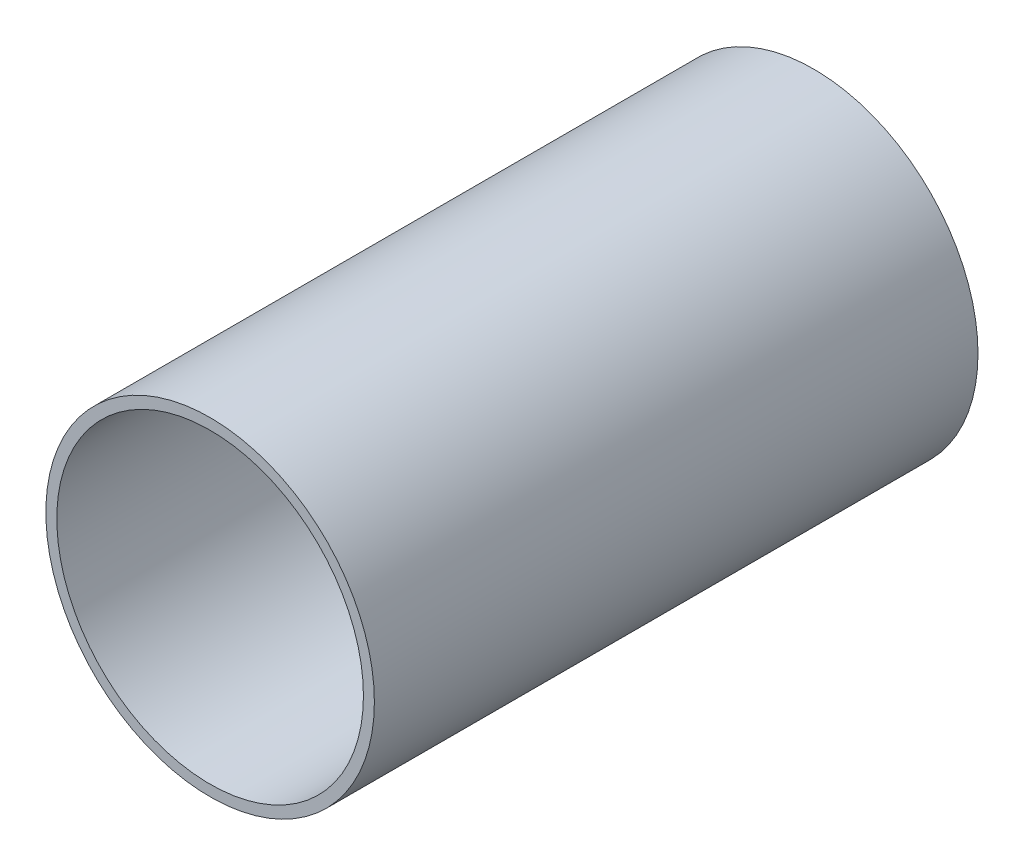
ISO-10303-21;
HEADER;
FILE_DESCRIPTION(('STEP AP214'),'2;1');
FILE_NAME('part.step','',(''),(''),'','','');
FILE_SCHEMA(('AUTOMOTIVE_DESIGN { 1 0 10303 214 1 1 1 1 }'));
ENDSEC;
DATA;
#1=APPLICATION_CONTEXT('core data for automotive mechanical design processes');
#2=APPLICATION_PROTOCOL_DEFINITION('international standard','automotive_design',2000,#1);
#3=PRODUCT_CONTEXT('',#1,'mechanical');
#4=PRODUCT('Part','Part','',(#3));
#5=PRODUCT_RELATED_PRODUCT_CATEGORY('part','',(#4));
#6=PRODUCT_DEFINITION_FORMATION('','',#4);
#7=PRODUCT_DEFINITION_CONTEXT('part definition',#1,'design');
#8=PRODUCT_DEFINITION('design','',#6,#7);
#9=PRODUCT_DEFINITION_SHAPE('','',#8);
#10=(LENGTH_UNIT() NAMED_UNIT(*) SI_UNIT(.MILLI.,.METRE.));
#11=(NAMED_UNIT(*) PLANE_ANGLE_UNIT() SI_UNIT($,.RADIAN.));
#12=(NAMED_UNIT(*) SI_UNIT($,.STERADIAN.) SOLID_ANGLE_UNIT());
#13=UNCERTAINTY_MEASURE_WITH_UNIT(LENGTH_MEASURE(1.E-05),#10,'distance_accuracy_value','');
#14=(GEOMETRIC_REPRESENTATION_CONTEXT(3) GLOBAL_UNCERTAINTY_ASSIGNED_CONTEXT((#13)) GLOBAL_UNIT_ASSIGNED_CONTEXT((#10,
#11,#12)) REPRESENTATION_CONTEXT('',''));
#15=CARTESIAN_POINT('',(0.,0.,0.));
#16=DIRECTION('',(0.,0.,1.));
#17=DIRECTION('',(1.,0.,0.));
#18=AXIS2_PLACEMENT_3D('',#15,#16,#17);
#19=CARTESIAN_POINT('',(0.,0.,0.));
#20=DIRECTION('',(0.,0.,-1.));
#21=DIRECTION('',(1.,0.,0.));
#22=AXIS2_PLACEMENT_3D('',#19,#20,#21);
#23=CYLINDRICAL_SURFACE('',#22,0.381);
#24=CARTESIAN_POINT('',(0.,0.,1.39999974));
#25=DIRECTION('',(0.,0.,1.));
#26=DIRECTION('',(1.,0.,0.));
#27=AXIS2_PLACEMENT_3D('',#24,#25,#26);
#28=CIRCLE('',#27,0.381);
#29=CARTESIAN_POINT('',(0.381,0.,1.39999974));
#30=VERTEX_POINT('',#29);
#31=EDGE_CURVE('E11',#30,#30,#28,.T.);
#32=ORIENTED_EDGE('',*,*,#31,.F.);
#33=DIRECTION('',(0.,0.,1.));
#34=VECTOR('',#33,1.);
#35=CARTESIAN_POINT('',(0.381,0.,0.));
#36=LINE('',#35,#34);
#37=CARTESIAN_POINT('',(0.381,0.,0.));
#38=VERTEX_POINT('',#37);
#39=EDGE_CURVE('E24',#38,#30,#36,.T.);
#40=ORIENTED_EDGE('',*,*,#39,.F.);
#41=CARTESIAN_POINT('',(0.,0.,0.));
#42=DIRECTION('',(0.,0.,1.));
#43=DIRECTION('',(1.,0.,0.));
#44=AXIS2_PLACEMENT_3D('',#41,#42,#43);
#45=CIRCLE('',#44,0.381);
#46=EDGE_CURVE('E46',#38,#38,#45,.T.);
#47=ORIENTED_EDGE('',*,*,#46,.T.);
#48=ORIENTED_EDGE('',*,*,#39,.T.);
#49=EDGE_LOOP('',(#32,#40,#47,#48));
#50=FACE_BOUND('',#49,.T.);
#51=ADVANCED_FACE('F17',(#50),#23,.T.);
#52=CARTESIAN_POINT('',(0.,0.,0.));
#53=DIRECTION('',(0.,0.,-1.));
#54=DIRECTION('',(1.,0.,0.));
#55=AXIS2_PLACEMENT_3D('',#52,#53,#54);
#56=CYLINDRICAL_SURFACE('',#55,0.3556);
#57=DIRECTION('',(0.,0.,1.));
#58=VECTOR('',#57,1.);
#59=CARTESIAN_POINT('',(0.3556,0.,0.));
#60=LINE('',#59,#58);
#61=CARTESIAN_POINT('',(0.3556,0.,0.));
#62=VERTEX_POINT('',#61);
#63=CARTESIAN_POINT('',(0.3556,0.,1.39999974));
#64=VERTEX_POINT('',#63);
#65=EDGE_CURVE('E40',#62,#64,#60,.T.);
#66=ORIENTED_EDGE('',*,*,#65,.T.);
#67=CARTESIAN_POINT('',(0.,0.,1.39999974));
#68=DIRECTION('',(0.,0.,1.));
#69=DIRECTION('',(1.,0.,0.));
#70=AXIS2_PLACEMENT_3D('',#67,#68,#69);
#71=CIRCLE('',#70,0.3556);
#72=EDGE_CURVE('E45',#64,#64,#71,.T.);
#73=ORIENTED_EDGE('',*,*,#72,.T.);
#74=ORIENTED_EDGE('',*,*,#65,.F.);
#75=CARTESIAN_POINT('',(0.,0.,0.));
#76=DIRECTION('',(0.,0.,1.));
#77=DIRECTION('',(1.,0.,0.));
#78=AXIS2_PLACEMENT_3D('',#75,#76,#77);
#79=CIRCLE('',#78,0.3556);
#80=EDGE_CURVE('E43',#62,#62,#79,.T.);
#81=ORIENTED_EDGE('',*,*,#80,.F.);
#82=EDGE_LOOP('',(#66,#73,#74,#81));
#83=FACE_BOUND('',#82,.T.);
#84=ADVANCED_FACE('F42',(#83),#56,.F.);
#85=CARTESIAN_POINT('',(0.381,0.,0.));
#86=DIRECTION('',(0.,0.,-1.));
#87=DIRECTION('',(-1.,0.,0.));
#88=AXIS2_PLACEMENT_3D('',#85,#86,#87);
#89=PLANE('',#88);
#90=ORIENTED_EDGE('',*,*,#46,.F.);
#91=EDGE_LOOP('',(#90));
#92=FACE_BOUND('',#91,.T.);
#93=ORIENTED_EDGE('',*,*,#80,.T.);
#94=EDGE_LOOP('',(#93));
#95=FACE_BOUND('',#94,.T.);
#96=ADVANCED_FACE('F49',(#92,#95),#89,.T.);
#97=CARTESIAN_POINT('',(0.381,0.,1.39999974));
#98=DIRECTION('',(0.,0.,-1.));
#99=DIRECTION('',(-1.,0.,0.));
#100=AXIS2_PLACEMENT_3D('',#97,#98,#99);
#101=PLANE('',#100);
#102=ORIENTED_EDGE('',*,*,#31,.T.);
#103=EDGE_LOOP('',(#102));
#104=FACE_BOUND('',#103,.T.);
#105=ORIENTED_EDGE('',*,*,#72,.F.);
#106=EDGE_LOOP('',(#105));
#107=FACE_BOUND('',#106,.T.);
#108=ADVANCED_FACE('F56',(#104,#107),#101,.F.);
#109=CLOSED_SHELL('',(#51,#84,#96,#108));
#110=MANIFOLD_SOLID_BREP('B1',#109);
#111=ADVANCED_BREP_SHAPE_REPRESENTATION('',(#18,#110),#14);
#112=SHAPE_DEFINITION_REPRESENTATION(#9,#111);
ENDSEC;
END-ISO-10303-21;
